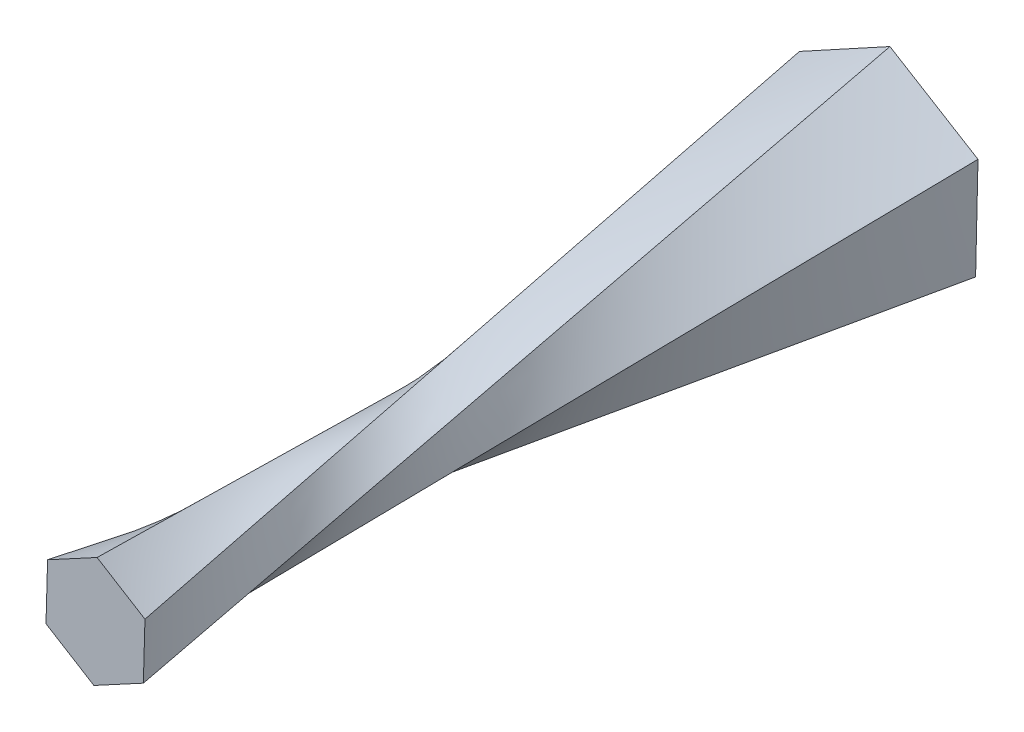
ISO-10303-21;
HEADER;
FILE_DESCRIPTION(('STEP AP214'),'2;1');
FILE_NAME('part.step','',(''),(''),'','','');
FILE_SCHEMA(('AUTOMOTIVE_DESIGN { 1 0 10303 214 1 1 1 1 }'));
ENDSEC;
DATA;
#1=APPLICATION_CONTEXT('core data for automotive mechanical design processes');
#2=APPLICATION_PROTOCOL_DEFINITION('international standard','automotive_design',2000,#1);
#3=PRODUCT_CONTEXT('',#1,'mechanical');
#4=PRODUCT('Part','Part','',(#3));
#5=PRODUCT_RELATED_PRODUCT_CATEGORY('part','',(#4));
#6=PRODUCT_DEFINITION_FORMATION('','',#4);
#7=PRODUCT_DEFINITION_CONTEXT('part definition',#1,'design');
#8=PRODUCT_DEFINITION('design','',#6,#7);
#9=PRODUCT_DEFINITION_SHAPE('','',#8);
#10=(LENGTH_UNIT() NAMED_UNIT(*) SI_UNIT(.MILLI.,.METRE.));
#11=(NAMED_UNIT(*) PLANE_ANGLE_UNIT() SI_UNIT($,.RADIAN.));
#12=(NAMED_UNIT(*) SI_UNIT($,.STERADIAN.) SOLID_ANGLE_UNIT());
#13=UNCERTAINTY_MEASURE_WITH_UNIT(LENGTH_MEASURE(1.E-05),#10,'distance_accuracy_value','');
#14=(GEOMETRIC_REPRESENTATION_CONTEXT(3) GLOBAL_UNCERTAINTY_ASSIGNED_CONTEXT((#13)) GLOBAL_UNIT_ASSIGNED_CONTEXT((#10,
#11,#12)) REPRESENTATION_CONTEXT('',''));
#15=CARTESIAN_POINT('',(0.,0.,0.));
#16=DIRECTION('',(0.,0.,1.));
#17=DIRECTION('',(1.,0.,0.));
#18=AXIS2_PLACEMENT_3D('',#15,#16,#17);
#19=CARTESIAN_POINT('',(0.,0.,203.2));
#20=DIRECTION('',(0.,0.,1.));
#21=DIRECTION('',(1.,0.,0.));
#22=AXIS2_PLACEMENT_3D('',#19,#20,#21);
#23=PLANE('',#22);
#24=DIRECTION('',(0.0283486938010653,0.999598095016079,0.));
#25=VECTOR('',#24,1.);
#26=CARTESIAN_POINT('',(12.2850605354866,-7.56505646806877,203.2));
#27=LINE('',#26,#25);
#28=CARTESIAN_POINT('',(12.2850605354866,-7.56505646806877,203.2));
#29=VERTEX_POINT('',#28);
#30=CARTESIAN_POINT('',(12.6940613501546,6.85664627672668,203.2));
#31=VERTEX_POINT('',#30);
#32=EDGE_CURVE('E189',#29,#31,#27,.T.);
#33=ORIENTED_EDGE('',*,*,#32,.T.);
#34=DIRECTION('',(-0.851502996957923,0.524349736503868,0.));
#35=VECTOR('',#34,1.);
#36=CARTESIAN_POINT('',(12.6940613501546,6.85664627672667,203.2));
#37=LINE('',#36,#35);
#38=CARTESIAN_POINT('',(0.409000814668029,14.4217027447954,203.2));
#39=VERTEX_POINT('',#38);
#40=EDGE_CURVE('E203',#31,#39,#37,.T.);
#41=ORIENTED_EDGE('',*,*,#40,.T.);
#42=DIRECTION('',(-0.879851690758988,-0.47524835851221,0.));
#43=VECTOR('',#42,1.);
#44=CARTESIAN_POINT('',(0.409000814668033,14.4217027447954,203.2));
#45=LINE('',#44,#43);
#46=CARTESIAN_POINT('',(-12.2850605354866,7.56505646806877,203.2));
#47=VERTEX_POINT('',#46);
#48=EDGE_CURVE('E374',#39,#47,#45,.T.);
#49=ORIENTED_EDGE('',*,*,#48,.T.);
#50=DIRECTION('',(-0.0283486938010653,-0.999598095016079,0.));
#51=VECTOR('',#50,1.);
#52=CARTESIAN_POINT('',(-12.2850605354866,7.56505646806877,203.2));
#53=LINE('',#52,#51);
#54=CARTESIAN_POINT('',(-12.6940613501546,-6.85664627672668,203.2));
#55=VERTEX_POINT('',#54);
#56=EDGE_CURVE('E262',#47,#55,#53,.T.);
#57=ORIENTED_EDGE('',*,*,#56,.T.);
#58=DIRECTION('',(0.851502996957922,-0.524349736503869,0.));
#59=VECTOR('',#58,1.);
#60=CARTESIAN_POINT('',(-12.6940613501546,-6.85664627672667,203.2));
#61=LINE('',#60,#59);
#62=CARTESIAN_POINT('',(-0.409000814668033,-14.4217027447954,203.2));
#63=VERTEX_POINT('',#62);
#64=EDGE_CURVE('E63',#55,#63,#61,.T.);
#65=ORIENTED_EDGE('',*,*,#64,.T.);
#66=DIRECTION('',(0.879851690758988,0.47524835851221,0.));
#67=VECTOR('',#66,1.);
#68=CARTESIAN_POINT('',(-0.409000814668033,-14.4217027447954,203.2));
#69=LINE('',#68,#67);
#70=EDGE_CURVE('E12',#63,#29,#69,.T.);
#71=ORIENTED_EDGE('',*,*,#70,.T.);
#72=EDGE_LOOP('',(#33,#41,#49,#57,#65,#71));
#73=FACE_BOUND('',#72,.T.);
#74=ADVANCED_FACE('F53',(#73),#23,.T.);
#75=CARTESIAN_POINT('',(0.,0.,0.));
#76=DIRECTION('',(0.,0.,1.));
#77=DIRECTION('',(1.,0.,0.));
#78=AXIS2_PLACEMENT_3D('',#75,#76,#77);
#79=PLANE('',#78);
#80=DIRECTION('',(0.0233162342238325,0.999728139656787,0.));
#81=VECTOR('',#80,1.);
#82=CARTESIAN_POINT('',(22.5933236234488,-13.7564303437454,0.));
#83=LINE('',#82,#81);
#84=CARTESIAN_POINT('',(22.5933236234488,-13.7564303437454,0.));
#85=VERTEX_POINT('',#84);
#86=CARTESIAN_POINT('',(23.2100799547991,12.688177041957,0.));
#87=VERTEX_POINT('',#86);
#88=EDGE_CURVE('E113',#85,#87,#83,.T.);
#89=ORIENTED_EDGE('',*,*,#88,.F.);
#90=DIRECTION('',(0.877448082932851,0.479671618669966,0.));
#91=VECTOR('',#90,1.);
#92=CARTESIAN_POINT('',(-0.61675633135026,-26.4446073857025,0.));
#93=LINE('',#92,#91);
#94=CARTESIAN_POINT('',(-0.61675633135026,-26.4446073857025,0.));
#95=VERTEX_POINT('',#94);
#96=EDGE_CURVE('E255',#95,#85,#93,.T.);
#97=ORIENTED_EDGE('',*,*,#96,.F.);
#98=DIRECTION('',(0.854131848709018,-0.520056520986821,0.));
#99=VECTOR('',#98,1.);
#100=CARTESIAN_POINT('',(-23.2100799547991,-12.688177041957,0.));
#101=LINE('',#100,#99);
#102=CARTESIAN_POINT('',(-23.2100799547991,-12.688177041957,0.));
#103=VERTEX_POINT('',#102);
#104=EDGE_CURVE('E244',#103,#95,#101,.T.);
#105=ORIENTED_EDGE('',*,*,#104,.F.);
#106=DIRECTION('',(-0.0233162342238325,-0.999728139656787,0.));
#107=VECTOR('',#106,1.);
#108=CARTESIAN_POINT('',(-22.5933236234488,13.7564303437455,0.));
#109=LINE('',#108,#107);
#110=CARTESIAN_POINT('',(-22.5933236234488,13.7564303437455,0.));
#111=VERTEX_POINT('',#110);
#112=EDGE_CURVE('E256',#111,#103,#109,.T.);
#113=ORIENTED_EDGE('',*,*,#112,.F.);
#114=DIRECTION('',(-0.877448082932851,-0.479671618669966,0.));
#115=VECTOR('',#114,1.);
#116=CARTESIAN_POINT('',(0.616756331350258,26.4446073857025,0.));
#117=LINE('',#116,#115);
#118=CARTESIAN_POINT('',(0.616756331350258,26.4446073857025,0.));
#119=VERTEX_POINT('',#118);
#120=EDGE_CURVE('E116',#119,#111,#117,.T.);
#121=ORIENTED_EDGE('',*,*,#120,.F.);
#122=DIRECTION('',(-0.854131848709018,0.520056520986821,0.));
#123=VECTOR('',#122,1.);
#124=CARTESIAN_POINT('',(23.2100799547991,12.688177041957,0.));
#125=LINE('',#124,#123);
#126=EDGE_CURVE('E110',#87,#119,#125,.T.);
#127=ORIENTED_EDGE('',*,*,#126,.F.);
#128=EDGE_LOOP('',(#89,#97,#105,#113,#121,#127));
#129=FACE_BOUND('',#128,.T.);
#130=ADVANCED_FACE('F112',(#129),#79,.F.);
#131=CARTESIAN_POINT('',(-0.61675633135026,-26.4446073857025,0.));
#132=CARTESIAN_POINT('',(-12.2850605354866,7.56505646806877,203.2));
#133=CARTESIAN_POINT('',(3.25159032778292,-24.329911212043,0.));
#134=CARTESIAN_POINT('',(-12.3532273379313,5.16143934393619,203.2));
#135=CARTESIAN_POINT('',(7.1199369869161,-22.2152150383835,0.));
#136=CARTESIAN_POINT('',(-12.4213941403759,2.75782221980362,203.2));
#137=CARTESIAN_POINT('',(14.8566303051825,-17.9858226910645,0.));
#138=CARTESIAN_POINT('',(-12.5577277452653,-2.04941202846153,203.2));
#139=CARTESIAN_POINT('',(18.7249769643156,-15.871126517405,0.));
#140=CARTESIAN_POINT('',(-12.62589454771,-4.4530291525941,203.2));
#141=CARTESIAN_POINT('',(22.5933236234488,-13.7564303437455,0.));
#142=CARTESIAN_POINT('',(-12.6940613501546,-6.85664627672668,203.2));
#143=B_SPLINE_SURFACE_WITH_KNOTS('',3,1,((#131,#132),(#133,#134),(#135,#136),(#137,#138),(#139,
#140),(#141,#142)),.UNSPECIFIED.,.F.,.F.,.F.,(4,2,4),(2,2),(0.,0.5,1.),(0.,1.),.UNSPECIFIED.);
#144=DIRECTION('',(-0.171001968887134,0.0334362169721245,0.984703176612788));
#145=VECTOR('',#144,1.);
#146=CARTESIAN_POINT('',(4.94963113664709,-10.3065383102361,101.6));
#147=LINE('',#146,#145);
#148=EDGE_CURVE('E128',#85,#55,#147,.T.);
#149=DIRECTION('',(0.0565443711392589,-0.164810157639477,-0.984703176612788));
#150=VECTOR('',#149,1.);
#151=CARTESIAN_POINT('',(-6.45090843341843,-9.43977545881686,101.6));
#152=LINE('',#151,#150);
#153=EDGE_CURVE('E139',#47,#95,#152,.T.);
#154=ORIENTED_EDGE('',*,*,#96,.T.);
#155=ORIENTED_EDGE('',*,*,#148,.T.);
#156=ORIENTED_EDGE('',*,*,#56,.F.);
#157=ORIENTED_EDGE('',*,*,#153,.T.);
#158=EDGE_LOOP('',(#154,#155,#156,#157));
#159=FACE_BOUND('',#158,.T.);
#160=ADVANCED_FACE('F259',(#159),#143,.T.);
#161=CARTESIAN_POINT('',(22.5933236234488,-13.7564303437454,0.));
#162=CARTESIAN_POINT('',(-12.6940613501546,-6.85664627672667,203.2));
#163=CARTESIAN_POINT('',(22.6961163453405,-9.3489957794617,0.));
#164=CARTESIAN_POINT('',(-10.6465512609069,-8.1174890214048,203.2));
#165=CARTESIAN_POINT('',(22.7989090672322,-4.94156121517795,0.));
#166=CARTESIAN_POINT('',(-8.59904117165911,-9.37833176608292,203.2));
#167=CARTESIAN_POINT('',(23.0044945110156,3.87330791338955,0.));
#168=CARTESIAN_POINT('',(-4.50402099316358,-11.9000172554392,203.2));
#169=CARTESIAN_POINT('',(23.1072872329074,8.28074247767329,0.));
#170=CARTESIAN_POINT('',(-2.45651090391581,-13.1608600001173,203.2));
#171=CARTESIAN_POINT('',(23.2100799547991,12.688177041957,0.));
#172=CARTESIAN_POINT('',(-0.409000814668032,-14.4217027447954,203.2));
#173=B_SPLINE_SURFACE_WITH_KNOTS('',3,1,((#161,#162),(#163,#164),(#165,#166),(#167,#168),(#169,
#170),(#171,#172)),.UNSPECIFIED.,.F.,.F.,.F.,(4,2,4),(2,2),(0.,0.5,1.),(0.,1.),.UNSPECIFIED.);
#174=DIRECTION('',(-0.114457597747875,-0.131373940667352,0.984703176612788));
#175=VECTOR('',#174,1.);
#176=CARTESIAN_POINT('',(11.4005395700655,-0.866762851419204,101.6));
#177=LINE('',#176,#175);
#178=EDGE_CURVE('E78',#87,#63,#177,.T.);
#179=ORIENTED_EDGE('',*,*,#88,.T.);
#180=ORIENTED_EDGE('',*,*,#178,.T.);
#181=ORIENTED_EDGE('',*,*,#64,.F.);
#182=ORIENTED_EDGE('',*,*,#148,.F.);
#183=EDGE_LOOP('',(#179,#180,#181,#182));
#184=FACE_BOUND('',#183,.T.);
#185=ADVANCED_FACE('F126',(#184),#173,.T.);
#186=CARTESIAN_POINT('',(-23.2100799547991,-12.688177041957,0.));
#187=CARTESIAN_POINT('',(0.409000814668033,14.4217027447954,203.2));
#188=CARTESIAN_POINT('',(-19.4445260175576,-14.9809154325813,0.));
#189=CARTESIAN_POINT('',(-1.7066760770244,13.278928365341,203.2));
#190=CARTESIAN_POINT('',(-15.6789720803161,-17.2736538232055,0.));
#191=CARTESIAN_POINT('',(-3.82235296871684,12.1361539858866,203.2));
#192=CARTESIAN_POINT('',(-8.14786420583318,-21.859130604454,0.));
#193=CARTESIAN_POINT('',(-8.05370675210172,9.85060522697766,203.2));
#194=CARTESIAN_POINT('',(-4.38231026859172,-24.1518689950782,0.));
#195=CARTESIAN_POINT('',(-10.1693836437942,8.70783084752322,203.2));
#196=CARTESIAN_POINT('',(-0.616756331350263,-26.4446073857025,0.));
#197=CARTESIAN_POINT('',(-12.2850605354866,7.56505646806877,203.2));
#198=B_SPLINE_SURFACE_WITH_KNOTS('',3,1,((#186,#187),(#188,#189),(#190,#191),(#192,#193),(#194,
#195),(#196,#197)),.UNSPECIFIED.,.F.,.F.,.F.,(4,2,4),(2,2),(0.,0.5,1.),(0.,1.),.UNSPECIFIED.);
#199=DIRECTION('',(0.114457597747875,0.131373940667352,0.984703176612788));
#200=VECTOR('',#199,1.);
#201=CARTESIAN_POINT('',(-11.4005395700655,0.866762851419204,101.6));
#202=LINE('',#201,#200);
#203=EDGE_CURVE('E231',#103,#39,#202,.T.);
#204=ORIENTED_EDGE('',*,*,#104,.T.);
#205=ORIENTED_EDGE('',*,*,#153,.F.);
#206=ORIENTED_EDGE('',*,*,#48,.F.);
#207=ORIENTED_EDGE('',*,*,#203,.F.);
#208=EDGE_LOOP('',(#204,#205,#206,#207));
#209=FACE_BOUND('',#208,.T.);
#210=ADVANCED_FACE('F163',(#209),#198,.T.);
#211=CARTESIAN_POINT('',(23.2100799547991,12.688177041957,0.));
#212=CARTESIAN_POINT('',(-0.409000814668033,-14.4217027447954,203.2));
#213=CARTESIAN_POINT('',(19.4445260175576,14.9809154325813,0.));
#214=CARTESIAN_POINT('',(1.70667607702441,-13.278928365341,203.2));
#215=CARTESIAN_POINT('',(15.6789720803161,17.2736538232055,0.));
#216=CARTESIAN_POINT('',(3.82235296871685,-12.1361539858865,203.2));
#217=CARTESIAN_POINT('',(8.14786420583317,21.859130604454,0.));
#218=CARTESIAN_POINT('',(8.05370675210172,-9.85060522697766,203.2));
#219=CARTESIAN_POINT('',(4.38231026859171,24.1518689950782,0.));
#220=CARTESIAN_POINT('',(10.1693836437942,-8.70783084752321,203.2));
#221=CARTESIAN_POINT('',(0.616756331350259,26.4446073857025,0.));
#222=CARTESIAN_POINT('',(12.2850605354866,-7.56505646806877,203.2));
#223=B_SPLINE_SURFACE_WITH_KNOTS('',3,1,((#211,#212),(#213,#214),(#215,#216),(#217,#218),(#219,
#220),(#221,#222)),.UNSPECIFIED.,.F.,.F.,.F.,(4,2,4),(2,2),(0.,0.5,1.),(0.,1.),.UNSPECIFIED.);
#224=DIRECTION('',(0.0565443711392589,-0.164810157639477,0.984703176612788));
#225=VECTOR('',#224,1.);
#226=CARTESIAN_POINT('',(6.45090843341843,9.43977545881686,101.6));
#227=LINE('',#226,#225);
#228=EDGE_CURVE('E135',#119,#29,#227,.T.);
#229=ORIENTED_EDGE('',*,*,#126,.T.);
#230=ORIENTED_EDGE('',*,*,#228,.T.);
#231=ORIENTED_EDGE('',*,*,#70,.F.);
#232=ORIENTED_EDGE('',*,*,#178,.F.);
#233=EDGE_LOOP('',(#229,#230,#231,#232));
#234=FACE_BOUND('',#233,.T.);
#235=ADVANCED_FACE('F133',(#234),#223,.T.);
#236=CARTESIAN_POINT('',(0.616756331350258,26.4446073857025,0.));
#237=CARTESIAN_POINT('',(12.2850605354866,-7.56505646806877,203.2));
#238=CARTESIAN_POINT('',(-3.25159032778292,24.329911212043,0.));
#239=CARTESIAN_POINT('',(12.3532273379313,-5.16143934393619,203.2));
#240=CARTESIAN_POINT('',(-7.1199369869161,22.2152150383835,0.));
#241=CARTESIAN_POINT('',(12.4213941403759,-2.75782221980362,203.2));
#242=CARTESIAN_POINT('',(-14.8566303051825,17.9858226910645,0.));
#243=CARTESIAN_POINT('',(12.5577277452653,2.04941202846153,203.2));
#244=CARTESIAN_POINT('',(-18.7249769643156,15.871126517405,0.));
#245=CARTESIAN_POINT('',(12.62589454771,4.4530291525941,203.2));
#246=CARTESIAN_POINT('',(-22.5933236234488,13.7564303437455,0.));
#247=CARTESIAN_POINT('',(12.6940613501546,6.85664627672668,203.2));
#248=B_SPLINE_SURFACE_WITH_KNOTS('',3,1,((#236,#237),(#238,#239),(#240,#241),(#242,#243),(#244,
#245),(#246,#247)),.UNSPECIFIED.,.F.,.F.,.F.,(4,2,4),(2,2),(0.,0.5,1.),(0.,1.),.UNSPECIFIED.);
#249=DIRECTION('',(0.171001968887134,-0.0334362169721245,0.984703176612788));
#250=VECTOR('',#249,1.);
#251=CARTESIAN_POINT('',(-4.94963113664709,10.3065383102361,101.6));
#252=LINE('',#251,#250);
#253=EDGE_CURVE('E137',#111,#31,#252,.T.);
#254=ORIENTED_EDGE('',*,*,#120,.T.);
#255=ORIENTED_EDGE('',*,*,#253,.T.);
#256=ORIENTED_EDGE('',*,*,#32,.F.);
#257=ORIENTED_EDGE('',*,*,#228,.F.);
#258=EDGE_LOOP('',(#254,#255,#256,#257));
#259=FACE_BOUND('',#258,.T.);
#260=ADVANCED_FACE('F162',(#259),#248,.T.);
#261=CARTESIAN_POINT('',(-22.5933236234488,13.7564303437455,0.));
#262=CARTESIAN_POINT('',(12.6940613501546,6.85664627672667,203.2));
#263=CARTESIAN_POINT('',(-22.6961163453405,9.3489957794617,0.));
#264=CARTESIAN_POINT('',(10.6465512609069,8.11748902140481,203.2));
#265=CARTESIAN_POINT('',(-22.7989090672322,4.94156121517795,0.));
#266=CARTESIAN_POINT('',(8.59904117165908,9.37833176608294,203.2));
#267=CARTESIAN_POINT('',(-23.0044945110157,-3.87330791338955,0.));
#268=CARTESIAN_POINT('',(4.50402099316355,11.9000172554392,203.2));
#269=CARTESIAN_POINT('',(-23.1072872329074,-8.2807424776733,0.));
#270=CARTESIAN_POINT('',(2.45651090391579,13.1608600001173,203.2));
#271=CARTESIAN_POINT('',(-23.2100799547991,-12.688177041957,0.));
#272=CARTESIAN_POINT('',(0.409000814668029,14.4217027447954,203.2));
#273=B_SPLINE_SURFACE_WITH_KNOTS('',3,1,((#261,#262),(#263,#264),(#265,#266),(#267,#268),(#269,
#270),(#271,#272)),.UNSPECIFIED.,.F.,.F.,.F.,(4,2,4),(2,2),(0.,0.5,1.),(0.,1.),.UNSPECIFIED.);
#274=ORIENTED_EDGE('',*,*,#112,.T.);
#275=ORIENTED_EDGE('',*,*,#203,.T.);
#276=ORIENTED_EDGE('',*,*,#40,.F.);
#277=ORIENTED_EDGE('',*,*,#253,.F.);
#278=EDGE_LOOP('',(#274,#275,#276,#277));
#279=FACE_BOUND('',#278,.T.);
#280=ADVANCED_FACE('F208',(#279),#273,.T.);
#281=CLOSED_SHELL('',(#74,#130,#160,#185,#210,#235,#260,#280));
#282=MANIFOLD_SOLID_BREP('B2',#281);
#283=ADVANCED_BREP_SHAPE_REPRESENTATION('',(#18,#282),#14);
#284=SHAPE_DEFINITION_REPRESENTATION(#9,#283);
ENDSEC;
END-ISO-10303-21;
